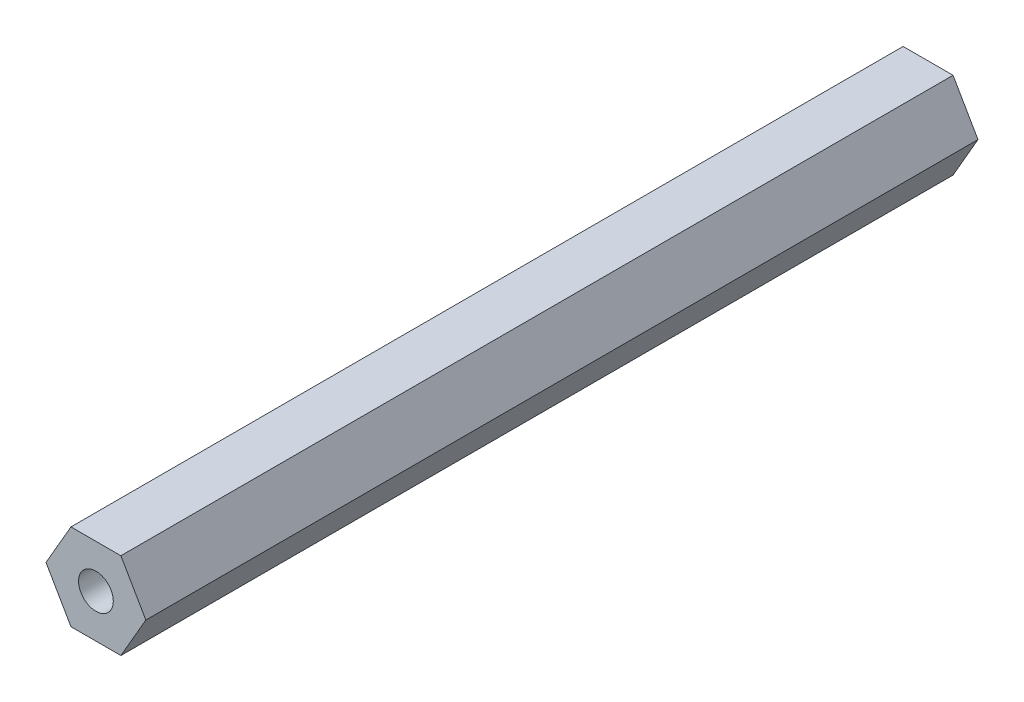
ISO-10303-21;
HEADER;
FILE_DESCRIPTION(('STEP AP214'),'2;1');
FILE_NAME('part.step','',(''),(''),'','','');
FILE_SCHEMA(('AUTOMOTIVE_DESIGN { 1 0 10303 214 1 1 1 1 }'));
ENDSEC;
DATA;
#1=APPLICATION_CONTEXT('core data for automotive mechanical design processes');
#2=APPLICATION_PROTOCOL_DEFINITION('international standard','automotive_design',2000,#1);
#3=PRODUCT_CONTEXT('',#1,'mechanical');
#4=PRODUCT('Part','Part','',(#3));
#5=PRODUCT_RELATED_PRODUCT_CATEGORY('part','',(#4));
#6=PRODUCT_DEFINITION_FORMATION('','',#4);
#7=PRODUCT_DEFINITION_CONTEXT('part definition',#1,'design');
#8=PRODUCT_DEFINITION('design','',#6,#7);
#9=PRODUCT_DEFINITION_SHAPE('','',#8);
#10=(LENGTH_UNIT() NAMED_UNIT(*) SI_UNIT(.MILLI.,.METRE.));
#11=(NAMED_UNIT(*) PLANE_ANGLE_UNIT() SI_UNIT($,.RADIAN.));
#12=(NAMED_UNIT(*) SI_UNIT($,.STERADIAN.) SOLID_ANGLE_UNIT());
#13=UNCERTAINTY_MEASURE_WITH_UNIT(LENGTH_MEASURE(1.E-05),#10,'distance_accuracy_value','');
#14=(GEOMETRIC_REPRESENTATION_CONTEXT(3) GLOBAL_UNCERTAINTY_ASSIGNED_CONTEXT((#13)) GLOBAL_UNIT_ASSIGNED_CONTEXT((#10,
#11,#12)) REPRESENTATION_CONTEXT('',''));
#15=CARTESIAN_POINT('',(0.,0.,0.));
#16=DIRECTION('',(0.,0.,1.));
#17=DIRECTION('',(1.,0.,0.));
#18=AXIS2_PLACEMENT_3D('',#15,#16,#17);
#19=CARTESIAN_POINT('',(0.,0.,122.2375));
#20=DIRECTION('',(0.,0.,1.));
#21=DIRECTION('',(1.,0.,0.));
#22=AXIS2_PLACEMENT_3D('',#19,#20,#21);
#23=PLANE('',#22);
#24=DIRECTION('',(0.5,0.866025403784439,0.));
#25=VECTOR('',#24,1.);
#26=CARTESIAN_POINT('',(3.66617420935412,-6.35,122.2375));
#27=LINE('',#26,#25);
#28=CARTESIAN_POINT('',(3.66617420935412,-6.35,122.2375));
#29=VERTEX_POINT('',#28);
#30=CARTESIAN_POINT('',(7.33234841870825,0.,122.2375));
#31=VERTEX_POINT('',#30);
#32=EDGE_CURVE('E135',#29,#31,#27,.T.);
#33=ORIENTED_EDGE('',*,*,#32,.T.);
#34=DIRECTION('',(-0.5,0.866025403784439,0.));
#35=VECTOR('',#34,1.);
#36=CARTESIAN_POINT('',(7.33234841870825,0.,122.2375));
#37=LINE('',#36,#35);
#38=CARTESIAN_POINT('',(3.66617420935412,6.35,122.2375));
#39=VERTEX_POINT('',#38);
#40=EDGE_CURVE('E93',#31,#39,#37,.T.);
#41=ORIENTED_EDGE('',*,*,#40,.T.);
#42=DIRECTION('',(-1.,0.,0.));
#43=VECTOR('',#42,1.);
#44=CARTESIAN_POINT('',(3.66617420935412,6.35,122.2375));
#45=LINE('',#44,#43);
#46=CARTESIAN_POINT('',(-3.66617420935412,6.35,122.2375));
#47=VERTEX_POINT('',#46);
#48=EDGE_CURVE('E106',#39,#47,#45,.T.);
#49=ORIENTED_EDGE('',*,*,#48,.T.);
#50=DIRECTION('',(-0.5,-0.866025403784439,0.));
#51=VECTOR('',#50,1.);
#52=CARTESIAN_POINT('',(-3.66617420935412,6.35,122.2375));
#53=LINE('',#52,#51);
#54=CARTESIAN_POINT('',(-7.33234841870825,0.,122.2375));
#55=VERTEX_POINT('',#54);
#56=EDGE_CURVE('E100',#47,#55,#53,.T.);
#57=ORIENTED_EDGE('',*,*,#56,.T.);
#58=DIRECTION('',(0.5,-0.866025403784439,0.));
#59=VECTOR('',#58,1.);
#60=CARTESIAN_POINT('',(-7.33234841870825,0.,122.2375));
#61=LINE('',#60,#59);
#62=CARTESIAN_POINT('',(-3.66617420935413,-6.35,122.2375));
#63=VERTEX_POINT('',#62);
#64=EDGE_CURVE('E104',#55,#63,#61,.T.);
#65=ORIENTED_EDGE('',*,*,#64,.T.);
#66=DIRECTION('',(1.,0.,0.));
#67=VECTOR('',#66,1.);
#68=CARTESIAN_POINT('',(-3.66617420935413,-6.35,122.2375));
#69=LINE('',#68,#67);
#70=EDGE_CURVE('E56',#63,#29,#69,.T.);
#71=ORIENTED_EDGE('',*,*,#70,.T.);
#72=EDGE_LOOP('',(#33,#41,#49,#57,#65,#71));
#73=FACE_BOUND('',#72,.T.);
#74=CARTESIAN_POINT('',(0.,0.,122.2375));
#75=DIRECTION('',(0.,0.,1.));
#76=DIRECTION('',(1.,0.,0.));
#77=AXIS2_PLACEMENT_3D('',#74,#75,#76);
#78=CIRCLE('',#77,2.5527);
#79=CARTESIAN_POINT('',(2.5527,0.,122.2375));
#80=VERTEX_POINT('',#79);
#81=EDGE_CURVE('E128',#80,#80,#78,.T.);
#82=ORIENTED_EDGE('',*,*,#81,.F.);
#83=EDGE_LOOP('',(#82));
#84=FACE_BOUND('',#83,.T.);
#85=ADVANCED_FACE('F39',(#73,#84),#23,.T.);
#86=CARTESIAN_POINT('',(0.,0.,0.));
#87=DIRECTION('',(0.,0.,1.));
#88=DIRECTION('',(1.,0.,0.));
#89=AXIS2_PLACEMENT_3D('',#86,#87,#88);
#90=PLANE('',#89);
#91=DIRECTION('',(0.5,0.866025403784439,0.));
#92=VECTOR('',#91,1.);
#93=CARTESIAN_POINT('',(3.66617420935412,-6.35,0.));
#94=LINE('',#93,#92);
#95=CARTESIAN_POINT('',(3.66617420935412,-6.35,0.));
#96=VERTEX_POINT('',#95);
#97=CARTESIAN_POINT('',(7.33234841870825,0.,0.));
#98=VERTEX_POINT('',#97);
#99=EDGE_CURVE('E124',#96,#98,#94,.T.);
#100=ORIENTED_EDGE('',*,*,#99,.F.);
#101=DIRECTION('',(1.,0.,0.));
#102=VECTOR('',#101,1.);
#103=CARTESIAN_POINT('',(-3.66617420935413,-6.35,0.));
#104=LINE('',#103,#102);
#105=CARTESIAN_POINT('',(-3.66617420935413,-6.35,0.));
#106=VERTEX_POINT('',#105);
#107=EDGE_CURVE('E85',#106,#96,#104,.T.);
#108=ORIENTED_EDGE('',*,*,#107,.F.);
#109=DIRECTION('',(0.5,-0.866025403784439,0.));
#110=VECTOR('',#109,1.);
#111=CARTESIAN_POINT('',(-7.33234841870825,0.,0.));
#112=LINE('',#111,#110);
#113=CARTESIAN_POINT('',(-7.33234841870825,0.,0.));
#114=VERTEX_POINT('',#113);
#115=EDGE_CURVE('E79',#114,#106,#112,.T.);
#116=ORIENTED_EDGE('',*,*,#115,.F.);
#117=DIRECTION('',(-0.5,-0.866025403784439,0.));
#118=VECTOR('',#117,1.);
#119=CARTESIAN_POINT('',(-3.66617420935412,6.35,0.));
#120=LINE('',#119,#118);
#121=CARTESIAN_POINT('',(-3.66617420935412,6.35,0.));
#122=VERTEX_POINT('',#121);
#123=EDGE_CURVE('E114',#122,#114,#120,.T.);
#124=ORIENTED_EDGE('',*,*,#123,.F.);
#125=DIRECTION('',(-1.,0.,0.));
#126=VECTOR('',#125,1.);
#127=CARTESIAN_POINT('',(3.66617420935412,6.35,0.));
#128=LINE('',#127,#126);
#129=CARTESIAN_POINT('',(3.66617420935412,6.35,0.));
#130=VERTEX_POINT('',#129);
#131=EDGE_CURVE('E130',#130,#122,#128,.T.);
#132=ORIENTED_EDGE('',*,*,#131,.F.);
#133=DIRECTION('',(-0.5,0.866025403784439,0.));
#134=VECTOR('',#133,1.);
#135=CARTESIAN_POINT('',(7.33234841870825,0.,0.));
#136=LINE('',#135,#134);
#137=EDGE_CURVE('E127',#98,#130,#136,.T.);
#138=ORIENTED_EDGE('',*,*,#137,.F.);
#139=EDGE_LOOP('',(#100,#108,#116,#124,#132,#138));
#140=FACE_BOUND('',#139,.T.);
#141=CARTESIAN_POINT('',(0.,0.,0.));
#142=DIRECTION('',(0.,0.,1.));
#143=DIRECTION('',(1.,0.,0.));
#144=AXIS2_PLACEMENT_3D('',#141,#142,#143);
#145=CIRCLE('',#144,2.5527);
#146=CARTESIAN_POINT('',(2.5527,0.,0.));
#147=VERTEX_POINT('',#146);
#148=EDGE_CURVE('E228',#147,#147,#145,.T.);
#149=ORIENTED_EDGE('',*,*,#148,.T.);
#150=EDGE_LOOP('',(#149));
#151=FACE_BOUND('',#150,.T.);
#152=ADVANCED_FACE('F144',(#140,#151),#90,.F.);
#153=CARTESIAN_POINT('',(3.66617420935412,-6.35,122.2375));
#154=DIRECTION('',(-0.866025403784439,0.5,0.));
#155=DIRECTION('',(-0.5,-0.866025403784439,0.));
#156=AXIS2_PLACEMENT_3D('',#153,#154,#155);
#157=PLANE('',#156);
#158=ORIENTED_EDGE('',*,*,#99,.T.);
#159=DIRECTION('',(0.,0.,-1.));
#160=VECTOR('',#159,1.);
#161=CARTESIAN_POINT('',(7.33234841870825,0.,122.2375));
#162=LINE('',#161,#160);
#163=EDGE_CURVE('E11',#31,#98,#162,.T.);
#164=ORIENTED_EDGE('',*,*,#163,.F.);
#165=ORIENTED_EDGE('',*,*,#32,.F.);
#166=DIRECTION('',(0.,0.,-1.));
#167=VECTOR('',#166,1.);
#168=CARTESIAN_POINT('',(3.66617420935412,-6.35,122.2375));
#169=LINE('',#168,#167);
#170=EDGE_CURVE('E120',#29,#96,#169,.T.);
#171=ORIENTED_EDGE('',*,*,#170,.T.);
#172=EDGE_LOOP('',(#158,#164,#165,#171));
#173=FACE_BOUND('',#172,.T.);
#174=ADVANCED_FACE('F41',(#173),#157,.F.);
#175=CARTESIAN_POINT('',(7.33234841870825,0.,122.2375));
#176=DIRECTION('',(-0.866025403784439,-0.5,0.));
#177=DIRECTION('',(0.5,-0.866025403784439,0.));
#178=AXIS2_PLACEMENT_3D('',#175,#176,#177);
#179=PLANE('',#178);
#180=ORIENTED_EDGE('',*,*,#137,.T.);
#181=DIRECTION('',(0.,0.,-1.));
#182=VECTOR('',#181,1.);
#183=CARTESIAN_POINT('',(3.66617420935412,6.35,122.2375));
#184=LINE('',#183,#182);
#185=EDGE_CURVE('E48',#39,#130,#184,.T.);
#186=ORIENTED_EDGE('',*,*,#185,.F.);
#187=ORIENTED_EDGE('',*,*,#40,.F.);
#188=ORIENTED_EDGE('',*,*,#163,.T.);
#189=EDGE_LOOP('',(#180,#186,#187,#188));
#190=FACE_BOUND('',#189,.T.);
#191=ADVANCED_FACE('F169',(#190),#179,.F.);
#192=CARTESIAN_POINT('',(3.66617420935412,6.35,122.2375));
#193=DIRECTION('',(0.,-1.,0.));
#194=DIRECTION('',(0.,0.,-1.));
#195=AXIS2_PLACEMENT_3D('',#192,#193,#194);
#196=PLANE('',#195);
#197=ORIENTED_EDGE('',*,*,#131,.T.);
#198=DIRECTION('',(0.,0.,-1.));
#199=VECTOR('',#198,1.);
#200=CARTESIAN_POINT('',(-3.66617420935412,6.35,122.2375));
#201=LINE('',#200,#199);
#202=EDGE_CURVE('E115',#47,#122,#201,.T.);
#203=ORIENTED_EDGE('',*,*,#202,.F.);
#204=ORIENTED_EDGE('',*,*,#48,.F.);
#205=ORIENTED_EDGE('',*,*,#185,.T.);
#206=EDGE_LOOP('',(#197,#203,#204,#205));
#207=FACE_BOUND('',#206,.T.);
#208=ADVANCED_FACE('F141',(#207),#196,.F.);
#209=CARTESIAN_POINT('',(-3.66617420935412,6.35,122.2375));
#210=DIRECTION('',(0.866025403784439,-0.5,0.));
#211=DIRECTION('',(0.5,0.866025403784439,0.));
#212=AXIS2_PLACEMENT_3D('',#209,#210,#211);
#213=PLANE('',#212);
#214=ORIENTED_EDGE('',*,*,#123,.T.);
#215=DIRECTION('',(0.,0.,-1.));
#216=VECTOR('',#215,1.);
#217=CARTESIAN_POINT('',(-7.33234841870825,0.,122.2375));
#218=LINE('',#217,#216);
#219=EDGE_CURVE('E111',#55,#114,#218,.T.);
#220=ORIENTED_EDGE('',*,*,#219,.F.);
#221=ORIENTED_EDGE('',*,*,#56,.F.);
#222=ORIENTED_EDGE('',*,*,#202,.T.);
#223=EDGE_LOOP('',(#214,#220,#221,#222));
#224=FACE_BOUND('',#223,.T.);
#225=ADVANCED_FACE('F112',(#224),#213,.F.);
#226=CARTESIAN_POINT('',(-7.33234841870825,0.,122.2375));
#227=DIRECTION('',(0.866025403784439,0.5,0.));
#228=DIRECTION('',(-0.5,0.866025403784439,0.));
#229=AXIS2_PLACEMENT_3D('',#226,#227,#228);
#230=PLANE('',#229);
#231=ORIENTED_EDGE('',*,*,#115,.T.);
#232=DIRECTION('',(0.,0.,-1.));
#233=VECTOR('',#232,1.);
#234=CARTESIAN_POINT('',(-3.66617420935413,-6.35,122.2375));
#235=LINE('',#234,#233);
#236=EDGE_CURVE('E116',#63,#106,#235,.T.);
#237=ORIENTED_EDGE('',*,*,#236,.F.);
#238=ORIENTED_EDGE('',*,*,#64,.F.);
#239=ORIENTED_EDGE('',*,*,#219,.T.);
#240=EDGE_LOOP('',(#231,#237,#238,#239));
#241=FACE_BOUND('',#240,.T.);
#242=ADVANCED_FACE('F118',(#241),#230,.F.);
#243=CARTESIAN_POINT('',(-3.66617420935413,-6.35,122.2375));
#244=DIRECTION('',(0.,1.,0.));
#245=DIRECTION('',(-1.,0.,0.));
#246=AXIS2_PLACEMENT_3D('',#243,#244,#245);
#247=PLANE('',#246);
#248=ORIENTED_EDGE('',*,*,#107,.T.);
#249=ORIENTED_EDGE('',*,*,#170,.F.);
#250=ORIENTED_EDGE('',*,*,#70,.F.);
#251=ORIENTED_EDGE('',*,*,#236,.T.);
#252=EDGE_LOOP('',(#248,#249,#250,#251));
#253=FACE_BOUND('',#252,.T.);
#254=ADVANCED_FACE('F149',(#253),#247,.F.);
#255=CARTESIAN_POINT('',(0.,0.,122.2375));
#256=DIRECTION('',(0.,0.,-1.));
#257=DIRECTION('',(-1.,0.,0.));
#258=AXIS2_PLACEMENT_3D('',#255,#256,#257);
#259=CYLINDRICAL_SURFACE('',#258,2.5527);
#260=ORIENTED_EDGE('',*,*,#81,.T.);
#261=EDGE_LOOP('',(#260));
#262=FACE_BOUND('',#261,.T.);
#263=ORIENTED_EDGE('',*,*,#148,.F.);
#264=EDGE_LOOP('',(#263));
#265=FACE_BOUND('',#264,.T.);
#266=ADVANCED_FACE('F151',(#262,#265),#259,.F.);
#267=CLOSED_SHELL('',(#85,#152,#174,#191,#208,#225,#242,#254,#266));
#268=MANIFOLD_SOLID_BREP('B2',#267);
#269=ADVANCED_BREP_SHAPE_REPRESENTATION('',(#18,#268),#14);
#270=SHAPE_DEFINITION_REPRESENTATION(#9,#269);
ENDSEC;
END-ISO-10303-21;
